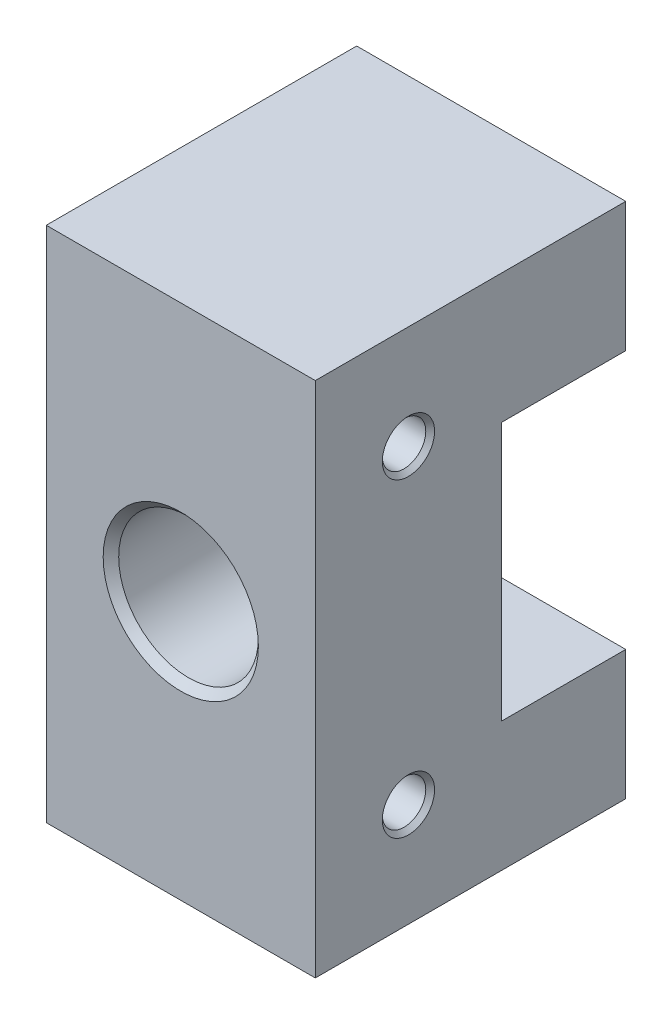
ISO-10303-21;
HEADER;
FILE_DESCRIPTION(('STEP AP214'),'2;1');
FILE_NAME('part.step','',(''),(''),'','','');
FILE_SCHEMA(('AUTOMOTIVE_DESIGN { 1 0 10303 214 1 1 1 1 }'));
ENDSEC;
DATA;
#1=APPLICATION_CONTEXT('core data for automotive mechanical design processes');
#2=APPLICATION_PROTOCOL_DEFINITION('international standard','automotive_design',2000,#1);
#3=PRODUCT_CONTEXT('',#1,'mechanical');
#4=PRODUCT('Part','Part','',(#3));
#5=PRODUCT_RELATED_PRODUCT_CATEGORY('part','',(#4));
#6=PRODUCT_DEFINITION_FORMATION('','',#4);
#7=PRODUCT_DEFINITION_CONTEXT('part definition',#1,'design');
#8=PRODUCT_DEFINITION('design','',#6,#7);
#9=PRODUCT_DEFINITION_SHAPE('','',#8);
#10=(LENGTH_UNIT() NAMED_UNIT(*) SI_UNIT(.MILLI.,.METRE.));
#11=(NAMED_UNIT(*) PLANE_ANGLE_UNIT() SI_UNIT($,.RADIAN.));
#12=(NAMED_UNIT(*) SI_UNIT($,.STERADIAN.) SOLID_ANGLE_UNIT());
#13=UNCERTAINTY_MEASURE_WITH_UNIT(LENGTH_MEASURE(1.E-05),#10,'distance_accuracy_value','');
#14=(GEOMETRIC_REPRESENTATION_CONTEXT(3) GLOBAL_UNCERTAINTY_ASSIGNED_CONTEXT((#13)) GLOBAL_UNIT_ASSIGNED_CONTEXT((#10,
#11,#12)) REPRESENTATION_CONTEXT('',''));
#15=CARTESIAN_POINT('',(0.,0.,0.));
#16=DIRECTION('',(0.,0.,1.));
#17=DIRECTION('',(1.,0.,0.));
#18=AXIS2_PLACEMENT_3D('',#15,#16,#17);
#19=CARTESIAN_POINT('',(-13.,25.,30.));
#20=DIRECTION('',(1.,0.,0.));
#21=DIRECTION('',(0.,1.,0.));
#22=AXIS2_PLACEMENT_3D('',#19,#20,#21);
#23=PLANE('',#22);
#24=CARTESIAN_POINT('',(-13.,15.,21.));
#25=DIRECTION('',(-1.,0.,0.));
#26=DIRECTION('',(0.,0.,1.));
#27=AXIS2_PLACEMENT_3D('',#24,#25,#26);
#28=CIRCLE('',#27,2.525);
#29=CARTESIAN_POINT('',(-13.,15.,23.525));
#30=VERTEX_POINT('',#29);
#31=EDGE_CURVE('E150',#30,#30,#28,.T.);
#32=ORIENTED_EDGE('',*,*,#31,.F.);
#33=EDGE_LOOP('',(#32));
#34=FACE_BOUND('',#33,.T.);
#35=DIRECTION('',(0.,0.,-1.));
#36=VECTOR('',#35,1.);
#37=CARTESIAN_POINT('',(-13.,-12.5,12.));
#38=LINE('',#37,#36);
#39=CARTESIAN_POINT('',(-13.,-12.5,12.));
#40=VERTEX_POINT('',#39);
#41=CARTESIAN_POINT('',(-13.,-12.5,0.));
#42=VERTEX_POINT('',#41);
#43=EDGE_CURVE('E231',#40,#42,#38,.T.);
#44=ORIENTED_EDGE('',*,*,#43,.T.);
#45=DIRECTION('',(0.,-1.,0.));
#46=VECTOR('',#45,1.);
#47=CARTESIAN_POINT('',(-13.,25.,0.));
#48=LINE('',#47,#46);
#49=CARTESIAN_POINT('',(-13.,-25.,0.));
#50=VERTEX_POINT('',#49);
#51=EDGE_CURVE('E254',#42,#50,#48,.T.);
#52=ORIENTED_EDGE('',*,*,#51,.T.);
#53=DIRECTION('',(0.,0.,-1.));
#54=VECTOR('',#53,1.);
#55=CARTESIAN_POINT('',(-13.,-25.,30.));
#56=LINE('',#55,#54);
#57=CARTESIAN_POINT('',(-13.,-25.,30.));
#58=VERTEX_POINT('',#57);
#59=EDGE_CURVE('E263',#58,#50,#56,.T.);
#60=ORIENTED_EDGE('',*,*,#59,.F.);
#61=DIRECTION('',(0.,-1.,0.));
#62=VECTOR('',#61,1.);
#63=CARTESIAN_POINT('',(-13.,25.,30.));
#64=LINE('',#63,#62);
#65=CARTESIAN_POINT('',(-13.,25.,30.));
#66=VERTEX_POINT('',#65);
#67=EDGE_CURVE('E241',#66,#58,#64,.T.);
#68=ORIENTED_EDGE('',*,*,#67,.F.);
#69=DIRECTION('',(0.,0.,-1.));
#70=VECTOR('',#69,1.);
#71=CARTESIAN_POINT('',(-13.,25.,30.));
#72=LINE('',#71,#70);
#73=CARTESIAN_POINT('',(-13.,25.,0.));
#74=VERTEX_POINT('',#73);
#75=EDGE_CURVE('E53',#66,#74,#72,.T.);
#76=ORIENTED_EDGE('',*,*,#75,.T.);
#77=CARTESIAN_POINT('',(-13.,12.5,0.));
#78=VERTEX_POINT('',#77);
#79=EDGE_CURVE('E255',#74,#78,#48,.T.);
#80=ORIENTED_EDGE('',*,*,#79,.T.);
#81=DIRECTION('',(0.,0.,-1.));
#82=VECTOR('',#81,1.);
#83=CARTESIAN_POINT('',(-13.,12.5,12.));
#84=LINE('',#83,#82);
#85=CARTESIAN_POINT('',(-13.,12.5,12.));
#86=VERTEX_POINT('',#85);
#87=EDGE_CURVE('E60',#86,#78,#84,.T.);
#88=ORIENTED_EDGE('',*,*,#87,.F.);
#89=DIRECTION('',(0.,-1.,0.));
#90=VECTOR('',#89,1.);
#91=CARTESIAN_POINT('',(-13.,12.5,12.));
#92=LINE('',#91,#90);
#93=EDGE_CURVE('E202',#86,#40,#92,.T.);
#94=ORIENTED_EDGE('',*,*,#93,.T.);
#95=EDGE_LOOP('',(#44,#52,#60,#68,#76,#80,#88,#94));
#96=FACE_BOUND('',#95,.T.);
#97=CARTESIAN_POINT('',(-13.,-15.,21.));
#98=DIRECTION('',(-1.,0.,0.));
#99=DIRECTION('',(0.,0.,1.));
#100=AXIS2_PLACEMENT_3D('',#97,#98,#99);
#101=CIRCLE('',#100,2.525);
#102=CARTESIAN_POINT('',(-13.,-15.,23.525));
#103=VERTEX_POINT('',#102);
#104=EDGE_CURVE('E140',#103,#103,#101,.T.);
#105=ORIENTED_EDGE('',*,*,#104,.F.);
#106=EDGE_LOOP('',(#105));
#107=FACE_BOUND('',#106,.T.);
#108=ADVANCED_FACE('F44',(#34,#96,#107),#23,.F.);
#109=CARTESIAN_POINT('',(13.,25.,30.));
#110=DIRECTION('',(-1.,0.,0.));
#111=DIRECTION('',(0.,-1.,0.));
#112=AXIS2_PLACEMENT_3D('',#109,#110,#111);
#113=PLANE('',#112);
#114=CARTESIAN_POINT('',(13.,15.,21.));
#115=DIRECTION('',(1.,0.,0.));
#116=DIRECTION('',(0.,0.,-1.));
#117=AXIS2_PLACEMENT_3D('',#114,#115,#116);
#118=CIRCLE('',#117,2.525);
#119=CARTESIAN_POINT('',(13.,15.,18.475));
#120=VERTEX_POINT('',#119);
#121=EDGE_CURVE('E161',#120,#120,#118,.T.);
#122=ORIENTED_EDGE('',*,*,#121,.F.);
#123=EDGE_LOOP('',(#122));
#124=FACE_BOUND('',#123,.T.);
#125=CARTESIAN_POINT('',(13.,-15.,21.));
#126=DIRECTION('',(1.,0.,0.));
#127=DIRECTION('',(0.,0.,-1.));
#128=AXIS2_PLACEMENT_3D('',#125,#126,#127);
#129=CIRCLE('',#128,2.525);
#130=CARTESIAN_POINT('',(13.,-15.,18.475));
#131=VERTEX_POINT('',#130);
#132=EDGE_CURVE('E173',#131,#131,#129,.T.);
#133=ORIENTED_EDGE('',*,*,#132,.F.);
#134=EDGE_LOOP('',(#133));
#135=FACE_BOUND('',#134,.T.);
#136=DIRECTION('',(0.,0.,-1.));
#137=VECTOR('',#136,1.);
#138=CARTESIAN_POINT('',(13.,-12.5,12.));
#139=LINE('',#138,#137);
#140=CARTESIAN_POINT('',(13.,-12.5,12.));
#141=VERTEX_POINT('',#140);
#142=CARTESIAN_POINT('',(13.,-12.5,0.));
#143=VERTEX_POINT('',#142);
#144=EDGE_CURVE('E228',#141,#143,#139,.T.);
#145=ORIENTED_EDGE('',*,*,#144,.F.);
#146=DIRECTION('',(0.,1.,0.));
#147=VECTOR('',#146,1.);
#148=CARTESIAN_POINT('',(13.,12.5,12.));
#149=LINE('',#148,#147);
#150=CARTESIAN_POINT('',(13.,12.5,12.));
#151=VERTEX_POINT('',#150);
#152=EDGE_CURVE('E210',#141,#151,#149,.T.);
#153=ORIENTED_EDGE('',*,*,#152,.T.);
#154=DIRECTION('',(0.,0.,-1.));
#155=VECTOR('',#154,1.);
#156=CARTESIAN_POINT('',(13.,12.5,12.));
#157=LINE('',#156,#155);
#158=CARTESIAN_POINT('',(13.,12.5,0.));
#159=VERTEX_POINT('',#158);
#160=EDGE_CURVE('E224',#151,#159,#157,.T.);
#161=ORIENTED_EDGE('',*,*,#160,.T.);
#162=DIRECTION('',(0.,1.,0.));
#163=VECTOR('',#162,1.);
#164=CARTESIAN_POINT('',(13.,25.,0.));
#165=LINE('',#164,#163);
#166=CARTESIAN_POINT('',(13.,25.,0.));
#167=VERTEX_POINT('',#166);
#168=EDGE_CURVE('E235',#159,#167,#165,.T.);
#169=ORIENTED_EDGE('',*,*,#168,.T.);
#170=DIRECTION('',(0.,0.,-1.));
#171=VECTOR('',#170,1.);
#172=CARTESIAN_POINT('',(13.,25.,30.));
#173=LINE('',#172,#171);
#174=CARTESIAN_POINT('',(13.,25.,30.));
#175=VERTEX_POINT('',#174);
#176=EDGE_CURVE('E11',#175,#167,#173,.T.);
#177=ORIENTED_EDGE('',*,*,#176,.F.);
#178=DIRECTION('',(0.,1.,0.));
#179=VECTOR('',#178,1.);
#180=CARTESIAN_POINT('',(13.,25.,30.));
#181=LINE('',#180,#179);
#182=CARTESIAN_POINT('',(13.,-25.,30.));
#183=VERTEX_POINT('',#182);
#184=EDGE_CURVE('E236',#183,#175,#181,.T.);
#185=ORIENTED_EDGE('',*,*,#184,.F.);
#186=DIRECTION('',(0.,0.,-1.));
#187=VECTOR('',#186,1.);
#188=CARTESIAN_POINT('',(13.,-25.,30.));
#189=LINE('',#188,#187);
#190=CARTESIAN_POINT('',(13.,-25.,0.));
#191=VERTEX_POINT('',#190);
#192=EDGE_CURVE('E246',#183,#191,#189,.T.);
#193=ORIENTED_EDGE('',*,*,#192,.T.);
#194=EDGE_CURVE('E247',#191,#143,#165,.T.);
#195=ORIENTED_EDGE('',*,*,#194,.T.);
#196=EDGE_LOOP('',(#145,#153,#161,#169,#177,#185,#193,#195));
#197=FACE_BOUND('',#196,.T.);
#198=ADVANCED_FACE('F46',(#124,#135,#197),#113,.F.);
#199=CARTESIAN_POINT('',(0.,0.,0.));
#200=DIRECTION('',(0.,0.,1.));
#201=DIRECTION('',(1.,0.,0.));
#202=AXIS2_PLACEMENT_3D('',#199,#200,#201);
#203=PLANE('',#202);
#204=DIRECTION('',(1.,0.,0.));
#205=VECTOR('',#204,1.);
#206=CARTESIAN_POINT('',(13.,-12.5,0.));
#207=LINE('',#206,#205);
#208=EDGE_CURVE('E201',#42,#143,#207,.T.);
#209=ORIENTED_EDGE('',*,*,#208,.T.);
#210=ORIENTED_EDGE('',*,*,#194,.F.);
#211=DIRECTION('',(1.,0.,0.));
#212=VECTOR('',#211,1.);
#213=CARTESIAN_POINT('',(-13.,-25.,0.));
#214=LINE('',#213,#212);
#215=EDGE_CURVE('E90',#50,#191,#214,.T.);
#216=ORIENTED_EDGE('',*,*,#215,.F.);
#217=ORIENTED_EDGE('',*,*,#51,.F.);
#218=EDGE_LOOP('',(#209,#210,#216,#217));
#219=FACE_BOUND('',#218,.T.);
#220=ADVANCED_FACE('F290',(#219),#203,.F.);
#221=DIRECTION('',(-1.,0.,0.));
#222=VECTOR('',#221,1.);
#223=CARTESIAN_POINT('',(13.,12.5,0.));
#224=LINE('',#223,#222);
#225=EDGE_CURVE('E207',#159,#78,#224,.T.);
#226=ORIENTED_EDGE('',*,*,#225,.T.);
#227=ORIENTED_EDGE('',*,*,#79,.F.);
#228=DIRECTION('',(-1.,0.,0.));
#229=VECTOR('',#228,1.);
#230=CARTESIAN_POINT('',(-13.,25.,0.));
#231=LINE('',#230,#229);
#232=EDGE_CURVE('E251',#167,#74,#231,.T.);
#233=ORIENTED_EDGE('',*,*,#232,.F.);
#234=ORIENTED_EDGE('',*,*,#168,.F.);
#235=EDGE_LOOP('',(#226,#227,#233,#234));
#236=FACE_BOUND('',#235,.T.);
#237=ADVANCED_FACE('F275',(#236),#203,.F.);
#238=CARTESIAN_POINT('',(-13.,25.,30.));
#239=DIRECTION('',(0.,-1.,0.));
#240=DIRECTION('',(0.,0.,-1.));
#241=AXIS2_PLACEMENT_3D('',#238,#239,#240);
#242=PLANE('',#241);
#243=ORIENTED_EDGE('',*,*,#232,.T.);
#244=ORIENTED_EDGE('',*,*,#75,.F.);
#245=DIRECTION('',(-1.,0.,0.));
#246=VECTOR('',#245,1.);
#247=CARTESIAN_POINT('',(-13.,25.,30.));
#248=LINE('',#247,#246);
#249=EDGE_CURVE('E97',#175,#66,#248,.T.);
#250=ORIENTED_EDGE('',*,*,#249,.F.);
#251=ORIENTED_EDGE('',*,*,#176,.T.);
#252=EDGE_LOOP('',(#243,#244,#250,#251));
#253=FACE_BOUND('',#252,.T.);
#254=ADVANCED_FACE('F333',(#253),#242,.F.);
#255=CARTESIAN_POINT('',(-13.,-25.,30.));
#256=DIRECTION('',(0.,1.,0.));
#257=DIRECTION('',(-1.,0.,0.));
#258=AXIS2_PLACEMENT_3D('',#255,#256,#257);
#259=PLANE('',#258);
#260=ORIENTED_EDGE('',*,*,#215,.T.);
#261=ORIENTED_EDGE('',*,*,#192,.F.);
#262=DIRECTION('',(1.,0.,0.));
#263=VECTOR('',#262,1.);
#264=CARTESIAN_POINT('',(-13.,-25.,30.));
#265=LINE('',#264,#263);
#266=EDGE_CURVE('E69',#58,#183,#265,.T.);
#267=ORIENTED_EDGE('',*,*,#266,.F.);
#268=ORIENTED_EDGE('',*,*,#59,.T.);
#269=EDGE_LOOP('',(#260,#261,#267,#268));
#270=FACE_BOUND('',#269,.T.);
#271=ADVANCED_FACE('F330',(#270),#259,.F.);
#272=CARTESIAN_POINT('',(0.,0.,30.));
#273=DIRECTION('',(0.,0.,1.));
#274=DIRECTION('',(1.,0.,0.));
#275=AXIS2_PLACEMENT_3D('',#272,#273,#274);
#276=PLANE('',#275);
#277=CARTESIAN_POINT('',(0.,0.,30.));
#278=DIRECTION('',(0.,0.,-1.));
#279=DIRECTION('',(-1.,0.,0.));
#280=AXIS2_PLACEMENT_3D('',#277,#278,#279);
#281=CIRCLE('',#280,7.5);
#282=CARTESIAN_POINT('',(-7.5,0.,30.));
#283=VERTEX_POINT('',#282);
#284=EDGE_CURVE('E185',#283,#283,#281,.T.);
#285=ORIENTED_EDGE('',*,*,#284,.T.);
#286=EDGE_LOOP('',(#285));
#287=FACE_BOUND('',#286,.T.);
#288=ORIENTED_EDGE('',*,*,#184,.T.);
#289=ORIENTED_EDGE('',*,*,#249,.T.);
#290=ORIENTED_EDGE('',*,*,#67,.T.);
#291=ORIENTED_EDGE('',*,*,#266,.T.);
#292=EDGE_LOOP('',(#288,#289,#290,#291));
#293=FACE_BOUND('',#292,.T.);
#294=ADVANCED_FACE('F332',(#287,#293),#276,.T.);
#295=CARTESIAN_POINT('',(13.,-12.5,12.));
#296=DIRECTION('',(0.,1.,0.));
#297=DIRECTION('',(0.,0.,1.));
#298=AXIS2_PLACEMENT_3D('',#295,#296,#297);
#299=PLANE('',#298);
#300=ORIENTED_EDGE('',*,*,#208,.F.);
#301=ORIENTED_EDGE('',*,*,#43,.F.);
#302=DIRECTION('',(1.,0.,0.));
#303=VECTOR('',#302,1.);
#304=CARTESIAN_POINT('',(13.,-12.5,12.));
#305=LINE('',#304,#303);
#306=EDGE_CURVE('E206',#40,#141,#305,.T.);
#307=ORIENTED_EDGE('',*,*,#306,.T.);
#308=ORIENTED_EDGE('',*,*,#144,.T.);
#309=EDGE_LOOP('',(#300,#301,#307,#308));
#310=FACE_BOUND('',#309,.T.);
#311=ADVANCED_FACE('F339',(#310),#299,.T.);
#312=CARTESIAN_POINT('',(13.,12.5,12.));
#313=DIRECTION('',(0.,-1.,0.));
#314=DIRECTION('',(0.,0.,-1.));
#315=AXIS2_PLACEMENT_3D('',#312,#313,#314);
#316=PLANE('',#315);
#317=ORIENTED_EDGE('',*,*,#225,.F.);
#318=ORIENTED_EDGE('',*,*,#160,.F.);
#319=DIRECTION('',(-1.,0.,0.));
#320=VECTOR('',#319,1.);
#321=CARTESIAN_POINT('',(13.,12.5,12.));
#322=LINE('',#321,#320);
#323=EDGE_CURVE('E214',#151,#86,#322,.T.);
#324=ORIENTED_EDGE('',*,*,#323,.T.);
#325=ORIENTED_EDGE('',*,*,#87,.T.);
#326=EDGE_LOOP('',(#317,#318,#324,#325));
#327=FACE_BOUND('',#326,.T.);
#328=ADVANCED_FACE('F277',(#327),#316,.T.);
#329=CARTESIAN_POINT('',(0.,0.,12.));
#330=DIRECTION('',(0.,0.,-1.));
#331=DIRECTION('',(-1.,0.,0.));
#332=AXIS2_PLACEMENT_3D('',#329,#330,#331);
#333=PLANE('',#332);
#334=CARTESIAN_POINT('',(0.,0.,12.));
#335=DIRECTION('',(0.,0.,-1.));
#336=DIRECTION('',(-1.,0.,0.));
#337=AXIS2_PLACEMENT_3D('',#334,#335,#336);
#338=CIRCLE('',#337,7.5);
#339=CARTESIAN_POINT('',(-7.5,0.,12.));
#340=VERTEX_POINT('',#339);
#341=EDGE_CURVE('E189',#340,#340,#338,.T.);
#342=ORIENTED_EDGE('',*,*,#341,.F.);
#343=EDGE_LOOP('',(#342));
#344=FACE_BOUND('',#343,.T.);
#345=ORIENTED_EDGE('',*,*,#93,.F.);
#346=ORIENTED_EDGE('',*,*,#323,.F.);
#347=ORIENTED_EDGE('',*,*,#152,.F.);
#348=ORIENTED_EDGE('',*,*,#306,.F.);
#349=EDGE_LOOP('',(#345,#346,#347,#348));
#350=FACE_BOUND('',#349,.T.);
#351=ADVANCED_FACE('F285',(#344,#350),#333,.T.);
#352=CARTESIAN_POINT('',(0.,0.,29.25));
#353=DIRECTION('',(0.,0.,1.));
#354=DIRECTION('',(1.,0.,0.));
#355=AXIS2_PLACEMENT_3D('',#352,#353,#354);
#356=CONICAL_SURFACE('',#355,6.75,0.785398163397443);
#357=ORIENTED_EDGE('',*,*,#284,.F.);
#358=EDGE_LOOP('',(#357));
#359=FACE_BOUND('',#358,.T.);
#360=CARTESIAN_POINT('',(0.,0.,29.25));
#361=DIRECTION('',(0.,0.,-1.));
#362=DIRECTION('',(-1.,0.,0.));
#363=AXIS2_PLACEMENT_3D('',#360,#361,#362);
#364=CIRCLE('',#363,6.75);
#365=CARTESIAN_POINT('',(-6.75,0.,29.25));
#366=VERTEX_POINT('',#365);
#367=EDGE_CURVE('E197',#366,#366,#364,.T.);
#368=ORIENTED_EDGE('',*,*,#367,.T.);
#369=EDGE_LOOP('',(#368));
#370=FACE_BOUND('',#369,.T.);
#371=ADVANCED_FACE('F408',(#359,#370),#356,.F.);
#372=CARTESIAN_POINT('',(0.,0.,12.));
#373=DIRECTION('',(0.,0.,-1.));
#374=DIRECTION('',(-1.,0.,0.));
#375=AXIS2_PLACEMENT_3D('',#372,#373,#374);
#376=CYLINDRICAL_SURFACE('',#375,6.75);
#377=ORIENTED_EDGE('',*,*,#367,.F.);
#378=EDGE_LOOP('',(#377));
#379=FACE_BOUND('',#378,.T.);
#380=CARTESIAN_POINT('',(0.,0.,12.75));
#381=DIRECTION('',(0.,0.,-1.));
#382=DIRECTION('',(-1.,0.,0.));
#383=AXIS2_PLACEMENT_3D('',#380,#381,#382);
#384=CIRCLE('',#383,6.75);
#385=CARTESIAN_POINT('',(-6.75,0.,12.75));
#386=VERTEX_POINT('',#385);
#387=EDGE_CURVE('E193',#386,#386,#384,.T.);
#388=ORIENTED_EDGE('',*,*,#387,.T.);
#389=EDGE_LOOP('',(#388));
#390=FACE_BOUND('',#389,.T.);
#391=ADVANCED_FACE('F404',(#379,#390),#376,.F.);
#392=CARTESIAN_POINT('',(0.,0.,12.));
#393=DIRECTION('',(0.,0.,-1.));
#394=DIRECTION('',(-1.,0.,0.));
#395=AXIS2_PLACEMENT_3D('',#392,#393,#394);
#396=CONICAL_SURFACE('',#395,7.5,0.785398163397452);
#397=ORIENTED_EDGE('',*,*,#387,.F.);
#398=EDGE_LOOP('',(#397));
#399=FACE_BOUND('',#398,.T.);
#400=ORIENTED_EDGE('',*,*,#341,.T.);
#401=EDGE_LOOP('',(#400));
#402=FACE_BOUND('',#401,.T.);
#403=ADVANCED_FACE('F400',(#399,#402),#396,.F.);
#404=CARTESIAN_POINT('',(2.26180729995788,-15.,21.));
#405=DIRECTION('',(1.,0.,0.));
#406=DIRECTION('',(0.,0.,-1.));
#407=AXIS2_PLACEMENT_3D('',#404,#405,#406);
#408=CONICAL_SURFACE('',#407,2.1,1.02974425867665);
#409=CARTESIAN_POINT('',(0.999999999999997,-15.,21.));
#410=VERTEX_POINT('',#409);
#411=VERTEX_LOOP('',#410);
#412=FACE_BOUND('',#411,.T.);
#413=CARTESIAN_POINT('',(2.26180729995788,-15.,21.));
#414=DIRECTION('',(1.,0.,0.));
#415=DIRECTION('',(0.,0.,-1.));
#416=AXIS2_PLACEMENT_3D('',#413,#414,#415);
#417=CIRCLE('',#416,2.1);
#418=CARTESIAN_POINT('',(2.26180729995788,-15.,18.9));
#419=VERTEX_POINT('',#418);
#420=EDGE_CURVE('E181',#419,#419,#417,.T.);
#421=ORIENTED_EDGE('',*,*,#420,.T.);
#422=EDGE_LOOP('',(#421));
#423=FACE_BOUND('',#422,.T.);
#424=ADVANCED_FACE('F396',(#412,#423),#408,.F.);
#425=CARTESIAN_POINT('',(13.,-15.,21.));
#426=DIRECTION('',(1.,0.,0.));
#427=DIRECTION('',(0.,0.,-1.));
#428=AXIS2_PLACEMENT_3D('',#425,#426,#427);
#429=CYLINDRICAL_SURFACE('',#428,2.1);
#430=ORIENTED_EDGE('',*,*,#420,.F.);
#431=EDGE_LOOP('',(#430));
#432=FACE_BOUND('',#431,.T.);
#433=CARTESIAN_POINT('',(12.575,-15.,21.));
#434=DIRECTION('',(1.,0.,0.));
#435=DIRECTION('',(0.,0.,-1.));
#436=AXIS2_PLACEMENT_3D('',#433,#434,#435);
#437=CIRCLE('',#436,2.1);
#438=CARTESIAN_POINT('',(12.575,-15.,18.9));
#439=VERTEX_POINT('',#438);
#440=EDGE_CURVE('E177',#439,#439,#437,.T.);
#441=ORIENTED_EDGE('',*,*,#440,.T.);
#442=EDGE_LOOP('',(#441));
#443=FACE_BOUND('',#442,.T.);
#444=ADVANCED_FACE('F392',(#432,#443),#429,.F.);
#445=CARTESIAN_POINT('',(13.,-15.,21.));
#446=DIRECTION('',(1.,0.,0.));
#447=DIRECTION('',(0.,0.,-1.));
#448=AXIS2_PLACEMENT_3D('',#445,#446,#447);
#449=CONICAL_SURFACE('',#448,2.525,0.785398163397446);
#450=ORIENTED_EDGE('',*,*,#440,.F.);
#451=EDGE_LOOP('',(#450));
#452=FACE_BOUND('',#451,.T.);
#453=ORIENTED_EDGE('',*,*,#132,.T.);
#454=EDGE_LOOP('',(#453));
#455=FACE_BOUND('',#454,.T.);
#456=ADVANCED_FACE('F388',(#452,#455),#449,.F.);
#457=CARTESIAN_POINT('',(2.26180729995787,15.,21.));
#458=DIRECTION('',(1.,0.,0.));
#459=DIRECTION('',(0.,0.,-1.));
#460=AXIS2_PLACEMENT_3D('',#457,#458,#459);
#461=CONICAL_SURFACE('',#460,2.1,1.02974425867665);
#462=CARTESIAN_POINT('',(0.999999999999994,15.,21.));
#463=VERTEX_POINT('',#462);
#464=VERTEX_LOOP('',#463);
#465=FACE_BOUND('',#464,.T.);
#466=CARTESIAN_POINT('',(2.26180729995787,15.,21.));
#467=DIRECTION('',(1.,0.,0.));
#468=DIRECTION('',(0.,0.,-1.));
#469=AXIS2_PLACEMENT_3D('',#466,#467,#468);
#470=CIRCLE('',#469,2.1);
#471=CARTESIAN_POINT('',(2.26180729995787,15.,18.9));
#472=VERTEX_POINT('',#471);
#473=EDGE_CURVE('E169',#472,#472,#470,.T.);
#474=ORIENTED_EDGE('',*,*,#473,.T.);
#475=EDGE_LOOP('',(#474));
#476=FACE_BOUND('',#475,.T.);
#477=ADVANCED_FACE('F384',(#465,#476),#461,.F.);
#478=CARTESIAN_POINT('',(13.,15.,21.));
#479=DIRECTION('',(1.,0.,0.));
#480=DIRECTION('',(0.,0.,-1.));
#481=AXIS2_PLACEMENT_3D('',#478,#479,#480);
#482=CYLINDRICAL_SURFACE('',#481,2.1);
#483=ORIENTED_EDGE('',*,*,#473,.F.);
#484=EDGE_LOOP('',(#483));
#485=FACE_BOUND('',#484,.T.);
#486=CARTESIAN_POINT('',(12.575,15.,21.));
#487=DIRECTION('',(1.,0.,0.));
#488=DIRECTION('',(0.,0.,-1.));
#489=AXIS2_PLACEMENT_3D('',#486,#487,#488);
#490=CIRCLE('',#489,2.1);
#491=CARTESIAN_POINT('',(12.575,15.,18.9));
#492=VERTEX_POINT('',#491);
#493=EDGE_CURVE('E165',#492,#492,#490,.T.);
#494=ORIENTED_EDGE('',*,*,#493,.T.);
#495=EDGE_LOOP('',(#494));
#496=FACE_BOUND('',#495,.T.);
#497=ADVANCED_FACE('F380',(#485,#496),#482,.F.);
#498=CARTESIAN_POINT('',(13.,15.,21.));
#499=DIRECTION('',(1.,0.,0.));
#500=DIRECTION('',(0.,0.,-1.));
#501=AXIS2_PLACEMENT_3D('',#498,#499,#500);
#502=CONICAL_SURFACE('',#501,2.525,0.785398163397444);
#503=ORIENTED_EDGE('',*,*,#493,.F.);
#504=EDGE_LOOP('',(#503));
#505=FACE_BOUND('',#504,.T.);
#506=ORIENTED_EDGE('',*,*,#121,.T.);
#507=EDGE_LOOP('',(#506));
#508=FACE_BOUND('',#507,.T.);
#509=ADVANCED_FACE('F376',(#505,#508),#502,.F.);
#510=CARTESIAN_POINT('',(-2.26180729995788,-15.,21.));
#511=DIRECTION('',(-1.,0.,0.));
#512=DIRECTION('',(0.,0.,1.));
#513=AXIS2_PLACEMENT_3D('',#510,#511,#512);
#514=CONICAL_SURFACE('',#513,2.1,1.02974425867665);
#515=CARTESIAN_POINT('',(-0.999999999999997,-15.,21.));
#516=VERTEX_POINT('',#515);
#517=VERTEX_LOOP('',#516);
#518=FACE_BOUND('',#517,.T.);
#519=CARTESIAN_POINT('',(-2.26180729995788,-15.,21.));
#520=DIRECTION('',(-1.,0.,0.));
#521=DIRECTION('',(0.,0.,1.));
#522=AXIS2_PLACEMENT_3D('',#519,#520,#521);
#523=CIRCLE('',#522,2.1);
#524=CARTESIAN_POINT('',(-2.26180729995788,-15.,23.1));
#525=VERTEX_POINT('',#524);
#526=EDGE_CURVE('E157',#525,#525,#523,.T.);
#527=ORIENTED_EDGE('',*,*,#526,.T.);
#528=EDGE_LOOP('',(#527));
#529=FACE_BOUND('',#528,.T.);
#530=ADVANCED_FACE('F372',(#518,#529),#514,.F.);
#531=CARTESIAN_POINT('',(-13.,-15.,21.));
#532=DIRECTION('',(-1.,0.,0.));
#533=DIRECTION('',(0.,0.,1.));
#534=AXIS2_PLACEMENT_3D('',#531,#532,#533);
#535=CYLINDRICAL_SURFACE('',#534,2.1);
#536=ORIENTED_EDGE('',*,*,#526,.F.);
#537=EDGE_LOOP('',(#536));
#538=FACE_BOUND('',#537,.T.);
#539=CARTESIAN_POINT('',(-12.575,-15.,21.));
#540=DIRECTION('',(-1.,0.,0.));
#541=DIRECTION('',(0.,0.,1.));
#542=AXIS2_PLACEMENT_3D('',#539,#540,#541);
#543=CIRCLE('',#542,2.1);
#544=CARTESIAN_POINT('',(-12.575,-15.,23.1));
#545=VERTEX_POINT('',#544);
#546=EDGE_CURVE('E147',#545,#545,#543,.T.);
#547=ORIENTED_EDGE('',*,*,#546,.T.);
#548=EDGE_LOOP('',(#547));
#549=FACE_BOUND('',#548,.T.);
#550=ADVANCED_FACE('F368',(#538,#549),#535,.F.);
#551=CARTESIAN_POINT('',(-13.,-15.,21.));
#552=DIRECTION('',(-1.,0.,0.));
#553=DIRECTION('',(0.,0.,1.));
#554=AXIS2_PLACEMENT_3D('',#551,#552,#553);
#555=CONICAL_SURFACE('',#554,2.525,0.785398163397446);
#556=ORIENTED_EDGE('',*,*,#546,.F.);
#557=EDGE_LOOP('',(#556));
#558=FACE_BOUND('',#557,.T.);
#559=ORIENTED_EDGE('',*,*,#104,.T.);
#560=EDGE_LOOP('',(#559));
#561=FACE_BOUND('',#560,.T.);
#562=ADVANCED_FACE('F133',(#558,#561),#555,.F.);
#563=CARTESIAN_POINT('',(-2.26180729995787,15.,21.));
#564=DIRECTION('',(-1.,0.,0.));
#565=DIRECTION('',(0.,0.,1.));
#566=AXIS2_PLACEMENT_3D('',#563,#564,#565);
#567=CONICAL_SURFACE('',#566,2.1,1.02974425867665);
#568=CARTESIAN_POINT('',(-0.999999999999994,15.,21.));
#569=VERTEX_POINT('',#568);
#570=VERTEX_LOOP('',#569);
#571=FACE_BOUND('',#570,.T.);
#572=CARTESIAN_POINT('',(-2.26180729995787,15.,21.));
#573=DIRECTION('',(-1.,0.,0.));
#574=DIRECTION('',(0.,0.,1.));
#575=AXIS2_PLACEMENT_3D('',#572,#573,#574);
#576=CIRCLE('',#575,2.1);
#577=CARTESIAN_POINT('',(-2.26180729995787,15.,23.1));
#578=VERTEX_POINT('',#577);
#579=EDGE_CURVE('E137',#578,#578,#576,.T.);
#580=ORIENTED_EDGE('',*,*,#579,.T.);
#581=EDGE_LOOP('',(#580));
#582=FACE_BOUND('',#581,.T.);
#583=ADVANCED_FACE('F129',(#571,#582),#567,.F.);
#584=CARTESIAN_POINT('',(-13.,15.,21.));
#585=DIRECTION('',(-1.,0.,0.));
#586=DIRECTION('',(0.,0.,1.));
#587=AXIS2_PLACEMENT_3D('',#584,#585,#586);
#588=CYLINDRICAL_SURFACE('',#587,2.1);
#589=ORIENTED_EDGE('',*,*,#579,.F.);
#590=EDGE_LOOP('',(#589));
#591=FACE_BOUND('',#590,.T.);
#592=CARTESIAN_POINT('',(-12.575,15.,21.));
#593=DIRECTION('',(-1.,0.,0.));
#594=DIRECTION('',(0.,0.,1.));
#595=AXIS2_PLACEMENT_3D('',#592,#593,#594);
#596=CIRCLE('',#595,2.1);
#597=CARTESIAN_POINT('',(-12.575,15.,23.1));
#598=VERTEX_POINT('',#597);
#599=EDGE_CURVE('E141',#598,#598,#596,.T.);
#600=ORIENTED_EDGE('',*,*,#599,.T.);
#601=EDGE_LOOP('',(#600));
#602=FACE_BOUND('',#601,.T.);
#603=ADVANCED_FACE('F132',(#591,#602),#588,.F.);
#604=CARTESIAN_POINT('',(-13.,15.,21.));
#605=DIRECTION('',(-1.,0.,0.));
#606=DIRECTION('',(0.,0.,1.));
#607=AXIS2_PLACEMENT_3D('',#604,#605,#606);
#608=CONICAL_SURFACE('',#607,2.525,0.785398163397444);
#609=ORIENTED_EDGE('',*,*,#599,.F.);
#610=EDGE_LOOP('',(#609));
#611=FACE_BOUND('',#610,.T.);
#612=ORIENTED_EDGE('',*,*,#31,.T.);
#613=EDGE_LOOP('',(#612));
#614=FACE_BOUND('',#613,.T.);
#615=ADVANCED_FACE('F356',(#611,#614),#608,.F.);
#616=CLOSED_SHELL('',(#108,#198,#220,#237,#254,#271,#294,#311,#328,#351,#371,#391,#403,#424,
#444,#456,#477,#497,#509,#530,#550,#562,#583,#603,#615));
#617=MANIFOLD_SOLID_BREP('B2',#616);
#618=ADVANCED_BREP_SHAPE_REPRESENTATION('',(#18,#617),#14);
#619=SHAPE_DEFINITION_REPRESENTATION(#9,#618);
ENDSEC;
END-ISO-10303-21;
